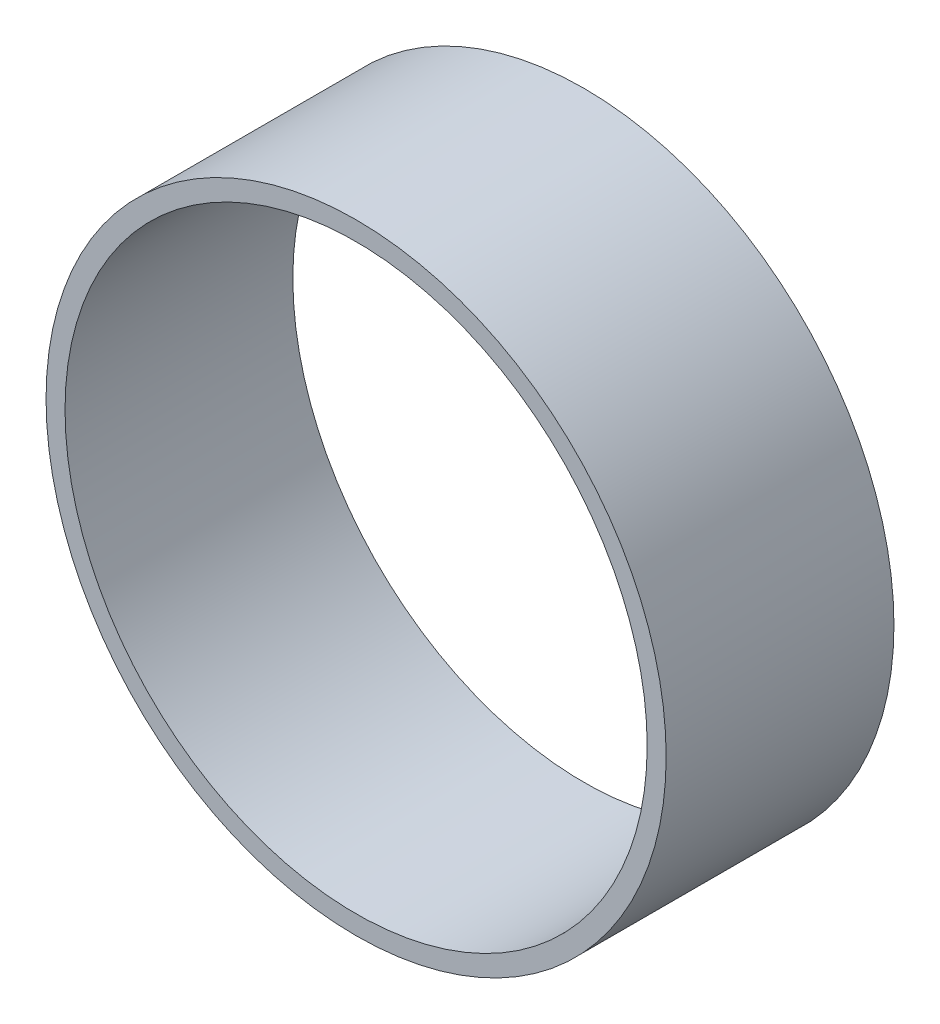
ISO-10303-21;
HEADER;
FILE_DESCRIPTION(('STEP AP214'),'2;1');
FILE_NAME('part.step','',(''),(''),'','','');
FILE_SCHEMA(('AUTOMOTIVE_DESIGN { 1 0 10303 214 1 1 1 1 }'));
ENDSEC;
DATA;
#1=APPLICATION_CONTEXT('core data for automotive mechanical design processes');
#2=APPLICATION_PROTOCOL_DEFINITION('international standard','automotive_design',2000,#1);
#3=PRODUCT_CONTEXT('',#1,'mechanical');
#4=PRODUCT('Part','Part','',(#3));
#5=PRODUCT_RELATED_PRODUCT_CATEGORY('part','',(#4));
#6=PRODUCT_DEFINITION_FORMATION('','',#4);
#7=PRODUCT_DEFINITION_CONTEXT('part definition',#1,'design');
#8=PRODUCT_DEFINITION('design','',#6,#7);
#9=PRODUCT_DEFINITION_SHAPE('','',#8);
#10=(LENGTH_UNIT() NAMED_UNIT(*) SI_UNIT(.MILLI.,.METRE.));
#11=(NAMED_UNIT(*) PLANE_ANGLE_UNIT() SI_UNIT($,.RADIAN.));
#12=(NAMED_UNIT(*) SI_UNIT($,.STERADIAN.) SOLID_ANGLE_UNIT());
#13=UNCERTAINTY_MEASURE_WITH_UNIT(LENGTH_MEASURE(1.E-05),#10,'distance_accuracy_value','');
#14=(GEOMETRIC_REPRESENTATION_CONTEXT(3) GLOBAL_UNCERTAINTY_ASSIGNED_CONTEXT((#13)) GLOBAL_UNIT_ASSIGNED_CONTEXT((#10,
#11,#12)) REPRESENTATION_CONTEXT('',''));
#15=CARTESIAN_POINT('',(0.,0.,0.));
#16=DIRECTION('',(0.,0.,1.));
#17=DIRECTION('',(1.,0.,0.));
#18=AXIS2_PLACEMENT_3D('',#15,#16,#17);
#19=CARTESIAN_POINT('',(0.,0.,90.));
#20=DIRECTION('',(0.,0.,1.));
#21=DIRECTION('',(1.,0.,0.));
#22=AXIS2_PLACEMENT_3D('',#19,#20,#21);
#23=PLANE('',#22);
#24=CARTESIAN_POINT('',(0.,0.,90.));
#25=DIRECTION('',(0.,0.,1.));
#26=DIRECTION('',(1.,0.,0.));
#27=AXIS2_PLACEMENT_3D('',#24,#25,#26);
#28=CIRCLE('',#27,122.5);
#29=CARTESIAN_POINT('',(-122.5,0.,90.));
#30=VERTEX_POINT('',#29);
#31=EDGE_CURVE('E10',#30,#30,#28,.T.);
#32=ORIENTED_EDGE('',*,*,#31,.T.);
#33=EDGE_LOOP('',(#32));
#34=FACE_BOUND('',#33,.T.);
#35=CARTESIAN_POINT('',(0.,0.,90.));
#36=DIRECTION('',(0.,0.,1.));
#37=DIRECTION('',(1.,0.,0.));
#38=AXIS2_PLACEMENT_3D('',#35,#36,#37);
#39=CIRCLE('',#38,115.);
#40=CARTESIAN_POINT('',(-115.,0.,90.));
#41=VERTEX_POINT('',#40);
#42=EDGE_CURVE('E43',#41,#41,#39,.T.);
#43=ORIENTED_EDGE('',*,*,#42,.F.);
#44=EDGE_LOOP('',(#43));
#45=FACE_BOUND('',#44,.T.);
#46=ADVANCED_FACE('F32',(#34,#45),#23,.T.);
#47=CARTESIAN_POINT('',(0.,0.,0.));
#48=DIRECTION('',(0.,0.,1.));
#49=DIRECTION('',(1.,0.,0.));
#50=AXIS2_PLACEMENT_3D('',#47,#48,#49);
#51=PLANE('',#50);
#52=CARTESIAN_POINT('',(0.,0.,0.));
#53=DIRECTION('',(0.,0.,1.));
#54=DIRECTION('',(1.,0.,0.));
#55=AXIS2_PLACEMENT_3D('',#52,#53,#54);
#56=CIRCLE('',#55,122.5);
#57=CARTESIAN_POINT('',(-122.5,0.,0.));
#58=VERTEX_POINT('',#57);
#59=EDGE_CURVE('E36',#58,#58,#56,.T.);
#60=ORIENTED_EDGE('',*,*,#59,.F.);
#61=EDGE_LOOP('',(#60));
#62=FACE_BOUND('',#61,.T.);
#63=CARTESIAN_POINT('',(0.,0.,0.));
#64=DIRECTION('',(0.,0.,1.));
#65=DIRECTION('',(1.,0.,0.));
#66=AXIS2_PLACEMENT_3D('',#63,#64,#65);
#67=CIRCLE('',#66,115.);
#68=CARTESIAN_POINT('',(-115.,0.,0.));
#69=VERTEX_POINT('',#68);
#70=EDGE_CURVE('E45',#69,#69,#67,.T.);
#71=ORIENTED_EDGE('',*,*,#70,.T.);
#72=EDGE_LOOP('',(#71));
#73=FACE_BOUND('',#72,.T.);
#74=ADVANCED_FACE('F55',(#62,#73),#51,.F.);
#75=CARTESIAN_POINT('',(0.,0.,90.));
#76=DIRECTION('',(0.,0.,-1.));
#77=DIRECTION('',(-1.,0.,0.));
#78=AXIS2_PLACEMENT_3D('',#75,#76,#77);
#79=CYLINDRICAL_SURFACE('',#78,122.5);
#80=CARTESIAN_POINT('',(-122.5,0.,90.));
#81=CARTESIAN_POINT('',(-122.5,0.,89.0625));
#82=CARTESIAN_POINT('',(-122.5,0.,88.125));
#83=CARTESIAN_POINT('',(-122.5,0.,86.25));
#84=CARTESIAN_POINT('',(-122.5,0.,85.3125));
#85=CARTESIAN_POINT('',(-122.5,0.,83.4375));
#86=CARTESIAN_POINT('',(-122.5,0.,82.5));
#87=CARTESIAN_POINT('',(-122.5,0.,80.625));
#88=CARTESIAN_POINT('',(-122.5,0.,79.6875));
#89=CARTESIAN_POINT('',(-122.5,0.,77.8125));
#90=CARTESIAN_POINT('',(-122.5,0.,76.875));
#91=CARTESIAN_POINT('',(-122.5,0.,75.));
#92=CARTESIAN_POINT('',(-122.5,0.,74.0625));
#93=CARTESIAN_POINT('',(-122.5,0.,72.1875));
#94=CARTESIAN_POINT('',(-122.5,0.,71.25));
#95=CARTESIAN_POINT('',(-122.5,0.,69.375));
#96=CARTESIAN_POINT('',(-122.5,0.,68.4375));
#97=CARTESIAN_POINT('',(-122.5,0.,66.5625));
#98=CARTESIAN_POINT('',(-122.5,0.,65.625));
#99=CARTESIAN_POINT('',(-122.5,0.,63.75));
#100=CARTESIAN_POINT('',(-122.5,0.,62.8125));
#101=CARTESIAN_POINT('',(-122.5,0.,60.9375));
#102=CARTESIAN_POINT('',(-122.5,0.,60.));
#103=CARTESIAN_POINT('',(-122.5,0.,58.125));
#104=CARTESIAN_POINT('',(-122.5,0.,57.1875));
#105=CARTESIAN_POINT('',(-122.5,0.,55.3125));
#106=CARTESIAN_POINT('',(-122.5,0.,54.375));
#107=CARTESIAN_POINT('',(-122.5,0.,52.5));
#108=CARTESIAN_POINT('',(-122.5,0.,51.5625));
#109=CARTESIAN_POINT('',(-122.5,0.,49.6875));
#110=CARTESIAN_POINT('',(-122.5,0.,48.75));
#111=CARTESIAN_POINT('',(-122.5,0.,46.875));
#112=CARTESIAN_POINT('',(-122.5,0.,45.9375));
#113=CARTESIAN_POINT('',(-122.5,0.,44.0625));
#114=CARTESIAN_POINT('',(-122.5,0.,43.125));
#115=CARTESIAN_POINT('',(-122.5,0.,41.25));
#116=CARTESIAN_POINT('',(-122.5,0.,40.3125));
#117=CARTESIAN_POINT('',(-122.5,0.,38.4375));
#118=CARTESIAN_POINT('',(-122.5,0.,37.5));
#119=CARTESIAN_POINT('',(-122.5,0.,35.625));
#120=CARTESIAN_POINT('',(-122.5,0.,34.6875));
#121=CARTESIAN_POINT('',(-122.5,0.,32.8125));
#122=CARTESIAN_POINT('',(-122.5,0.,31.875));
#123=CARTESIAN_POINT('',(-122.5,0.,30.));
#124=CARTESIAN_POINT('',(-122.5,0.,29.0625));
#125=CARTESIAN_POINT('',(-122.5,0.,27.1875));
#126=CARTESIAN_POINT('',(-122.5,0.,26.25));
#127=CARTESIAN_POINT('',(-122.5,0.,24.375));
#128=CARTESIAN_POINT('',(-122.5,0.,23.4375));
#129=CARTESIAN_POINT('',(-122.5,0.,21.5625));
#130=CARTESIAN_POINT('',(-122.5,0.,20.625));
#131=CARTESIAN_POINT('',(-122.5,0.,18.75));
#132=CARTESIAN_POINT('',(-122.5,0.,17.8125));
#133=CARTESIAN_POINT('',(-122.5,0.,15.9375));
#134=CARTESIAN_POINT('',(-122.5,0.,15.));
#135=CARTESIAN_POINT('',(-122.5,0.,13.125));
#136=CARTESIAN_POINT('',(-122.5,0.,12.1875));
#137=CARTESIAN_POINT('',(-122.5,0.,10.3125));
#138=CARTESIAN_POINT('',(-122.5,0.,9.37499999999999));
#139=CARTESIAN_POINT('',(-122.5,0.,7.49999999999999));
#140=CARTESIAN_POINT('',(-122.5,0.,6.56249999999999));
#141=CARTESIAN_POINT('',(-122.5,0.,4.68749999999999));
#142=CARTESIAN_POINT('',(-122.5,0.,3.74999999999998));
#143=CARTESIAN_POINT('',(-122.5,0.,1.87499999999998));
#144=CARTESIAN_POINT('',(-122.5,0.,0.937499999999986));
#145=CARTESIAN_POINT('',(-122.5,0.,0.));
#146=B_SPLINE_CURVE_WITH_KNOTS('',3,(#80,#81,#82,#83,#84,#85,#86,#87,#88,#89,#90,#91,#92,#93,
#94,#95,#96,#97,#98,#99,#100,#101,#102,#103,#104,#105,#106,#107,#108,#109,#110,#111,#112,#113,
#114,#115,#116,#117,#118,#119,#120,#121,#122,#123,#124,#125,#126,#127,#128,#129,#130,#131,#132,
#133,#134,#135,#136,#137,#138,#139,#140,#141,#142,#143,#144,#145),.UNSPECIFIED.,.F.,.F.,(4,2,2,
2,2,2,2,2,2,2,2,2,2,2,2,2,2,2,2,2,2,2,2,2,2,2,2,2,2,2,2,2,4),(0.,2.8125,5.62499999999999,
8.43749999999999,11.25,14.0625,16.875,19.6875,22.5,25.3125,28.125,30.9375,33.75,36.5625,39.375,
42.1875,45.,47.8125,50.625,53.4375,56.25,59.0625,61.875,64.6875,67.5,70.3125,73.125,75.9375,
78.75,81.5625,84.375,87.1875,90.),.UNSPECIFIED.);
#147=EDGE_CURVE('BSEAM34',#30,#58,#146,.T.);
#148=ORIENTED_EDGE('',*,*,#31,.F.);
#149=ORIENTED_EDGE('',*,*,#59,.T.);
#150=ORIENTED_EDGE('',*,*,#147,.T.);
#151=ORIENTED_EDGE('',*,*,#147,.F.);
#152=EDGE_LOOP('',(#148,#150,#149,#151));
#153=FACE_BOUND('',#152,.T.);
#154=ADVANCED_FACE('F34',(#153),#79,.T.);
#155=CARTESIAN_POINT('',(0.,0.,90.));
#156=DIRECTION('',(0.,0.,-1.));
#157=DIRECTION('',(-1.,0.,0.));
#158=AXIS2_PLACEMENT_3D('',#155,#156,#157);
#159=CYLINDRICAL_SURFACE('',#158,115.);
#160=CARTESIAN_POINT('',(-115.,0.,90.));
#161=CARTESIAN_POINT('',(-115.,0.,89.0625));
#162=CARTESIAN_POINT('',(-115.,0.,88.125));
#163=CARTESIAN_POINT('',(-115.,0.,86.25));
#164=CARTESIAN_POINT('',(-115.,0.,85.3125));
#165=CARTESIAN_POINT('',(-115.,0.,83.4375));
#166=CARTESIAN_POINT('',(-115.,0.,82.5));
#167=CARTESIAN_POINT('',(-115.,0.,80.625));
#168=CARTESIAN_POINT('',(-115.,0.,79.6875));
#169=CARTESIAN_POINT('',(-115.,0.,77.8125));
#170=CARTESIAN_POINT('',(-115.,0.,76.875));
#171=CARTESIAN_POINT('',(-115.,0.,75.));
#172=CARTESIAN_POINT('',(-115.,0.,74.0625));
#173=CARTESIAN_POINT('',(-115.,0.,72.1875));
#174=CARTESIAN_POINT('',(-115.,0.,71.25));
#175=CARTESIAN_POINT('',(-115.,0.,69.375));
#176=CARTESIAN_POINT('',(-115.,0.,68.4375));
#177=CARTESIAN_POINT('',(-115.,0.,66.5625));
#178=CARTESIAN_POINT('',(-115.,0.,65.625));
#179=CARTESIAN_POINT('',(-115.,0.,63.75));
#180=CARTESIAN_POINT('',(-115.,0.,62.8125));
#181=CARTESIAN_POINT('',(-115.,0.,60.9375));
#182=CARTESIAN_POINT('',(-115.,0.,60.));
#183=CARTESIAN_POINT('',(-115.,0.,58.125));
#184=CARTESIAN_POINT('',(-115.,0.,57.1875));
#185=CARTESIAN_POINT('',(-115.,0.,55.3125));
#186=CARTESIAN_POINT('',(-115.,0.,54.375));
#187=CARTESIAN_POINT('',(-115.,0.,52.5));
#188=CARTESIAN_POINT('',(-115.,0.,51.5625));
#189=CARTESIAN_POINT('',(-115.,0.,49.6875));
#190=CARTESIAN_POINT('',(-115.,0.,48.75));
#191=CARTESIAN_POINT('',(-115.,0.,46.875));
#192=CARTESIAN_POINT('',(-115.,0.,45.9375));
#193=CARTESIAN_POINT('',(-115.,0.,44.0625));
#194=CARTESIAN_POINT('',(-115.,0.,43.125));
#195=CARTESIAN_POINT('',(-115.,0.,41.25));
#196=CARTESIAN_POINT('',(-115.,0.,40.3125));
#197=CARTESIAN_POINT('',(-115.,0.,38.4375));
#198=CARTESIAN_POINT('',(-115.,0.,37.5));
#199=CARTESIAN_POINT('',(-115.,0.,35.625));
#200=CARTESIAN_POINT('',(-115.,0.,34.6875));
#201=CARTESIAN_POINT('',(-115.,0.,32.8125));
#202=CARTESIAN_POINT('',(-115.,0.,31.875));
#203=CARTESIAN_POINT('',(-115.,0.,30.));
#204=CARTESIAN_POINT('',(-115.,0.,29.0625));
#205=CARTESIAN_POINT('',(-115.,0.,27.1875));
#206=CARTESIAN_POINT('',(-115.,0.,26.25));
#207=CARTESIAN_POINT('',(-115.,0.,24.375));
#208=CARTESIAN_POINT('',(-115.,0.,23.4375));
#209=CARTESIAN_POINT('',(-115.,0.,21.5625));
#210=CARTESIAN_POINT('',(-115.,0.,20.625));
#211=CARTESIAN_POINT('',(-115.,0.,18.75));
#212=CARTESIAN_POINT('',(-115.,0.,17.8125));
#213=CARTESIAN_POINT('',(-115.,0.,15.9375));
#214=CARTESIAN_POINT('',(-115.,0.,15.));
#215=CARTESIAN_POINT('',(-115.,0.,13.125));
#216=CARTESIAN_POINT('',(-115.,0.,12.1875));
#217=CARTESIAN_POINT('',(-115.,0.,10.3125));
#218=CARTESIAN_POINT('',(-115.,0.,9.37499999999999));
#219=CARTESIAN_POINT('',(-115.,0.,7.49999999999999));
#220=CARTESIAN_POINT('',(-115.,0.,6.56249999999999));
#221=CARTESIAN_POINT('',(-115.,0.,4.68749999999999));
#222=CARTESIAN_POINT('',(-115.,0.,3.74999999999998));
#223=CARTESIAN_POINT('',(-115.,0.,1.87499999999998));
#224=CARTESIAN_POINT('',(-115.,0.,0.937499999999986));
#225=CARTESIAN_POINT('',(-115.,0.,0.));
#226=B_SPLINE_CURVE_WITH_KNOTS('',3,(#160,#161,#162,#163,#164,#165,#166,#167,#168,#169,#170,
#171,#172,#173,#174,#175,#176,#177,#178,#179,#180,#181,#182,#183,#184,#185,#186,#187,#188,#189,
#190,#191,#192,#193,#194,#195,#196,#197,#198,#199,#200,#201,#202,#203,#204,#205,#206,#207,#208,
#209,#210,#211,#212,#213,#214,#215,#216,#217,#218,#219,#220,#221,#222,#223,#224,#225),
.UNSPECIFIED.,.F.,.F.,(4,2,2,2,2,2,2,2,2,2,2,2,2,2,2,2,2,2,2,2,2,2,2,2,2,2,2,2,2,2,2,2,4),(0.,
2.81250000000001,5.62500000000001,8.43750000000001,11.25,14.0625,16.875,19.6875,22.5,25.3125,
28.125,30.9375,33.75,36.5625,39.375,42.1875,45.,47.8125,50.625,53.4375,56.25,59.0625,61.875,
64.6875,67.5,70.3125,73.125,75.9375,78.75,81.5625,84.375,87.1875,90.),.UNSPECIFIED.);
#227=EDGE_CURVE('BSEAM51',#41,#69,#226,.T.);
#228=ORIENTED_EDGE('',*,*,#42,.T.);
#229=ORIENTED_EDGE('',*,*,#70,.F.);
#230=ORIENTED_EDGE('',*,*,#227,.T.);
#231=ORIENTED_EDGE('',*,*,#227,.F.);
#232=EDGE_LOOP('',(#228,#230,#229,#231));
#233=FACE_BOUND('',#232,.T.);
#234=ADVANCED_FACE('F51',(#233),#159,.F.);
#235=CLOSED_SHELL('',(#46,#74,#154,#234));
#236=MANIFOLD_SOLID_BREP('B2',#235);
#237=ADVANCED_BREP_SHAPE_REPRESENTATION('',(#18,#236),#14);
#238=SHAPE_DEFINITION_REPRESENTATION(#9,#237);
ENDSEC;
END-ISO-10303-21;
